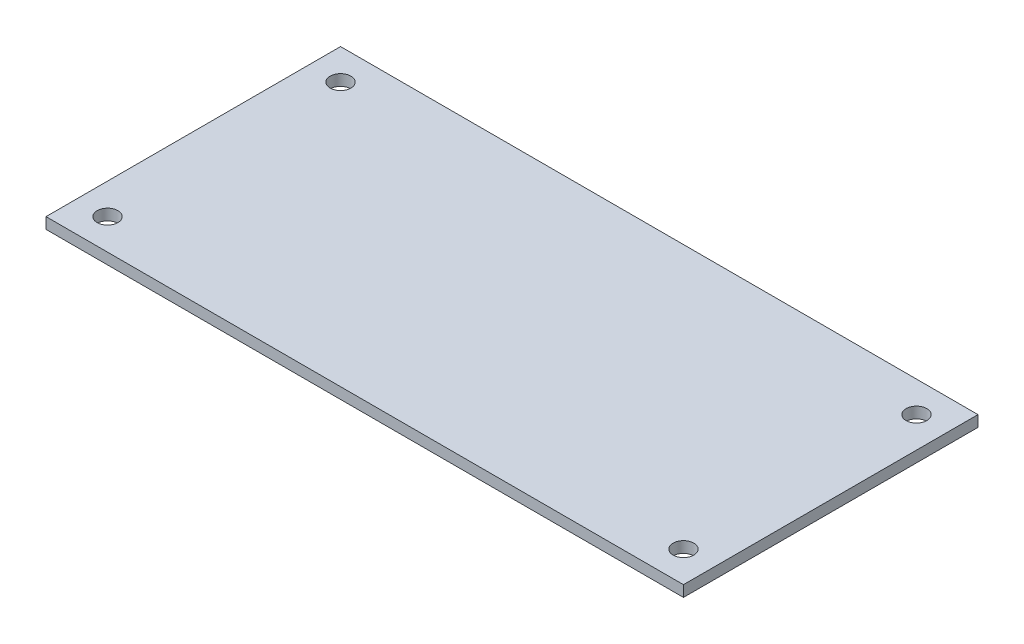
ISO-10303-21;
HEADER;
FILE_DESCRIPTION(('STEP AP214'),'2;1');
FILE_NAME('part.step','',(''),(''),'','','');
FILE_SCHEMA(('AUTOMOTIVE_DESIGN { 1 0 10303 214 1 1 1 1 }'));
ENDSEC;
DATA;
#1=APPLICATION_CONTEXT('core data for automotive mechanical design processes');
#2=APPLICATION_PROTOCOL_DEFINITION('international standard','automotive_design',2000,#1);
#3=PRODUCT_CONTEXT('',#1,'mechanical');
#4=PRODUCT('Part','Part','',(#3));
#5=PRODUCT_RELATED_PRODUCT_CATEGORY('part','',(#4));
#6=PRODUCT_DEFINITION_FORMATION('','',#4);
#7=PRODUCT_DEFINITION_CONTEXT('part definition',#1,'design');
#8=PRODUCT_DEFINITION('design','',#6,#7);
#9=PRODUCT_DEFINITION_SHAPE('','',#8);
#10=(LENGTH_UNIT() NAMED_UNIT(*) SI_UNIT(.MILLI.,.METRE.));
#11=(NAMED_UNIT(*) PLANE_ANGLE_UNIT() SI_UNIT($,.RADIAN.));
#12=(NAMED_UNIT(*) SI_UNIT($,.STERADIAN.) SOLID_ANGLE_UNIT());
#13=UNCERTAINTY_MEASURE_WITH_UNIT(LENGTH_MEASURE(1.E-05),#10,'distance_accuracy_value','');
#14=(GEOMETRIC_REPRESENTATION_CONTEXT(3) GLOBAL_UNCERTAINTY_ASSIGNED_CONTEXT((#13)) GLOBAL_UNIT_ASSIGNED_CONTEXT((#10,
#11,#12)) REPRESENTATION_CONTEXT('',''));
#15=CARTESIAN_POINT('',(0.,0.,0.));
#16=DIRECTION('',(0.,0.,1.));
#17=DIRECTION('',(1.,0.,0.));
#18=AXIS2_PLACEMENT_3D('',#15,#16,#17);
#19=CARTESIAN_POINT('',(46.0375,1.6,-21.2725));
#20=DIRECTION('',(-1.,0.,0.));
#21=DIRECTION('',(0.,0.,1.));
#22=AXIS2_PLACEMENT_3D('',#19,#20,#21);
#23=PLANE('',#22);
#24=DIRECTION('',(0.,0.,-1.));
#25=VECTOR('',#24,1.);
#26=CARTESIAN_POINT('',(46.0375,0.,-21.2725));
#27=LINE('',#26,#25);
#28=CARTESIAN_POINT('',(46.0375,0.,21.2725));
#29=VERTEX_POINT('',#28);
#30=CARTESIAN_POINT('',(46.0375,0.,-21.2725));
#31=VERTEX_POINT('',#30);
#32=EDGE_CURVE('E98',#29,#31,#27,.T.);
#33=ORIENTED_EDGE('',*,*,#32,.T.);
#34=DIRECTION('',(0.,-1.,0.));
#35=VECTOR('',#34,1.);
#36=CARTESIAN_POINT('',(46.0375,1.6,-21.2725));
#37=LINE('',#36,#35);
#38=CARTESIAN_POINT('',(46.0375,1.6,-21.2725));
#39=VERTEX_POINT('',#38);
#40=EDGE_CURVE('E11',#39,#31,#37,.T.);
#41=ORIENTED_EDGE('',*,*,#40,.F.);
#42=DIRECTION('',(0.,0.,-1.));
#43=VECTOR('',#42,1.);
#44=CARTESIAN_POINT('',(46.0375,1.6,-21.2725));
#45=LINE('',#44,#43);
#46=CARTESIAN_POINT('',(46.0375,1.6,21.2725));
#47=VERTEX_POINT('',#46);
#48=EDGE_CURVE('E86',#47,#39,#45,.T.);
#49=ORIENTED_EDGE('',*,*,#48,.F.);
#50=DIRECTION('',(0.,-1.,0.));
#51=VECTOR('',#50,1.);
#52=CARTESIAN_POINT('',(46.0375,1.6,21.2725));
#53=LINE('',#52,#51);
#54=EDGE_CURVE('E94',#47,#29,#53,.T.);
#55=ORIENTED_EDGE('',*,*,#54,.T.);
#56=EDGE_LOOP('',(#33,#41,#49,#55));
#57=FACE_BOUND('',#56,.T.);
#58=ADVANCED_FACE('F35',(#57),#23,.F.);
#59=CARTESIAN_POINT('',(-46.0375,1.6,-21.2725));
#60=DIRECTION('',(0.,0.,1.));
#61=DIRECTION('',(1.,0.,0.));
#62=AXIS2_PLACEMENT_3D('',#59,#60,#61);
#63=PLANE('',#62);
#64=DIRECTION('',(-1.,0.,0.));
#65=VECTOR('',#64,1.);
#66=CARTESIAN_POINT('',(-46.0375,0.,-21.2725));
#67=LINE('',#66,#65);
#68=CARTESIAN_POINT('',(-46.0375,0.,-21.2725));
#69=VERTEX_POINT('',#68);
#70=EDGE_CURVE('E90',#31,#69,#67,.T.);
#71=ORIENTED_EDGE('',*,*,#70,.T.);
#72=DIRECTION('',(0.,-1.,0.));
#73=VECTOR('',#72,1.);
#74=CARTESIAN_POINT('',(-46.0375,1.6,-21.2725));
#75=LINE('',#74,#73);
#76=CARTESIAN_POINT('',(-46.0375,1.6,-21.2725));
#77=VERTEX_POINT('',#76);
#78=EDGE_CURVE('E43',#77,#69,#75,.T.);
#79=ORIENTED_EDGE('',*,*,#78,.F.);
#80=DIRECTION('',(-1.,0.,0.));
#81=VECTOR('',#80,1.);
#82=CARTESIAN_POINT('',(-46.0375,1.6,-21.2725));
#83=LINE('',#82,#81);
#84=EDGE_CURVE('E81',#39,#77,#83,.T.);
#85=ORIENTED_EDGE('',*,*,#84,.F.);
#86=ORIENTED_EDGE('',*,*,#40,.T.);
#87=EDGE_LOOP('',(#71,#79,#85,#86));
#88=FACE_BOUND('',#87,.T.);
#89=ADVANCED_FACE('F89',(#88),#63,.F.);
#90=CARTESIAN_POINT('',(-46.0375,1.6,-21.2725));
#91=DIRECTION('',(1.,0.,0.));
#92=DIRECTION('',(0.,0.,-1.));
#93=AXIS2_PLACEMENT_3D('',#90,#91,#92);
#94=PLANE('',#93);
#95=DIRECTION('',(0.,0.,1.));
#96=VECTOR('',#95,1.);
#97=CARTESIAN_POINT('',(-46.0375,0.,-21.2725));
#98=LINE('',#97,#96);
#99=CARTESIAN_POINT('',(-46.0375,0.,21.2725));
#100=VERTEX_POINT('',#99);
#101=EDGE_CURVE('E68',#69,#100,#98,.T.);
#102=ORIENTED_EDGE('',*,*,#101,.T.);
#103=DIRECTION('',(0.,-1.,0.));
#104=VECTOR('',#103,1.);
#105=CARTESIAN_POINT('',(-46.0375,1.6,21.2725));
#106=LINE('',#105,#104);
#107=CARTESIAN_POINT('',(-46.0375,1.6,21.2725));
#108=VERTEX_POINT('',#107);
#109=EDGE_CURVE('E91',#108,#100,#106,.T.);
#110=ORIENTED_EDGE('',*,*,#109,.F.);
#111=DIRECTION('',(0.,0.,1.));
#112=VECTOR('',#111,1.);
#113=CARTESIAN_POINT('',(-46.0375,1.6,-21.2725));
#114=LINE('',#113,#112);
#115=EDGE_CURVE('E84',#77,#108,#114,.T.);
#116=ORIENTED_EDGE('',*,*,#115,.F.);
#117=ORIENTED_EDGE('',*,*,#78,.T.);
#118=EDGE_LOOP('',(#102,#110,#116,#117));
#119=FACE_BOUND('',#118,.T.);
#120=ADVANCED_FACE('F92',(#119),#94,.F.);
#121=CARTESIAN_POINT('',(-46.0375,1.6,21.2725));
#122=DIRECTION('',(0.,0.,-1.));
#123=DIRECTION('',(-1.,0.,0.));
#124=AXIS2_PLACEMENT_3D('',#121,#122,#123);
#125=PLANE('',#124);
#126=DIRECTION('',(1.,0.,0.));
#127=VECTOR('',#126,1.);
#128=CARTESIAN_POINT('',(-46.0375,0.,21.2725));
#129=LINE('',#128,#127);
#130=EDGE_CURVE('E74',#100,#29,#129,.T.);
#131=ORIENTED_EDGE('',*,*,#130,.T.);
#132=ORIENTED_EDGE('',*,*,#54,.F.);
#133=DIRECTION('',(1.,0.,0.));
#134=VECTOR('',#133,1.);
#135=CARTESIAN_POINT('',(-46.0375,1.6,21.2725));
#136=LINE('',#135,#134);
#137=EDGE_CURVE('E51',#108,#47,#136,.T.);
#138=ORIENTED_EDGE('',*,*,#137,.F.);
#139=ORIENTED_EDGE('',*,*,#109,.T.);
#140=EDGE_LOOP('',(#131,#132,#138,#139));
#141=FACE_BOUND('',#140,.T.);
#142=ADVANCED_FACE('F106',(#141),#125,.F.);
#143=CARTESIAN_POINT('',(0.,1.6,0.));
#144=DIRECTION('',(0.,1.,0.));
#145=DIRECTION('',(0.,0.,1.));
#146=AXIS2_PLACEMENT_3D('',#143,#144,#145);
#147=PLANE('',#146);
#148=CARTESIAN_POINT('',(-41.5925,1.6,-16.8275));
#149=DIRECTION('',(0.,-1.,0.));
#150=DIRECTION('',(0.,0.,-1.));
#151=AXIS2_PLACEMENT_3D('',#148,#149,#150);
#152=CIRCLE('',#151,1.5);
#153=CARTESIAN_POINT('',(-41.5925,1.6,-18.3275));
#154=VERTEX_POINT('',#153);
#155=EDGE_CURVE('E129',#154,#154,#152,.T.);
#156=ORIENTED_EDGE('',*,*,#155,.T.);
#157=EDGE_LOOP('',(#156));
#158=FACE_BOUND('',#157,.T.);
#159=CARTESIAN_POINT('',(-41.5925,1.6,16.8275));
#160=DIRECTION('',(0.,-1.,0.));
#161=DIRECTION('',(0.,0.,-1.));
#162=AXIS2_PLACEMENT_3D('',#159,#160,#161);
#163=CIRCLE('',#162,1.5);
#164=CARTESIAN_POINT('',(-41.5925,1.6,15.3275));
#165=VERTEX_POINT('',#164);
#166=EDGE_CURVE('E123',#165,#165,#163,.T.);
#167=ORIENTED_EDGE('',*,*,#166,.T.);
#168=EDGE_LOOP('',(#167));
#169=FACE_BOUND('',#168,.T.);
#170=CARTESIAN_POINT('',(41.5925,1.6,16.8275));
#171=DIRECTION('',(0.,-1.,0.));
#172=DIRECTION('',(0.,0.,-1.));
#173=AXIS2_PLACEMENT_3D('',#170,#171,#172);
#174=CIRCLE('',#173,1.5);
#175=CARTESIAN_POINT('',(41.5925,1.6,15.3275));
#176=VERTEX_POINT('',#175);
#177=EDGE_CURVE('E117',#176,#176,#174,.T.);
#178=ORIENTED_EDGE('',*,*,#177,.T.);
#179=EDGE_LOOP('',(#178));
#180=FACE_BOUND('',#179,.T.);
#181=CARTESIAN_POINT('',(41.5925,1.6,-16.8275));
#182=DIRECTION('',(0.,-1.,0.));
#183=DIRECTION('',(0.,0.,-1.));
#184=AXIS2_PLACEMENT_3D('',#181,#182,#183);
#185=CIRCLE('',#184,1.5);
#186=CARTESIAN_POINT('',(41.5925,1.6,-18.3275));
#187=VERTEX_POINT('',#186);
#188=EDGE_CURVE('E101',#187,#187,#185,.T.);
#189=ORIENTED_EDGE('',*,*,#188,.T.);
#190=EDGE_LOOP('',(#189));
#191=FACE_BOUND('',#190,.T.);
#192=ORIENTED_EDGE('',*,*,#48,.T.);
#193=ORIENTED_EDGE('',*,*,#84,.T.);
#194=ORIENTED_EDGE('',*,*,#115,.T.);
#195=ORIENTED_EDGE('',*,*,#137,.T.);
#196=EDGE_LOOP('',(#192,#193,#194,#195));
#197=FACE_BOUND('',#196,.T.);
#198=ADVANCED_FACE('F82',(#158,#169,#180,#191,#197),#147,.T.);
#199=CARTESIAN_POINT('',(0.,0.,0.));
#200=DIRECTION('',(0.,1.,0.));
#201=DIRECTION('',(0.,0.,1.));
#202=AXIS2_PLACEMENT_3D('',#199,#200,#201);
#203=PLANE('',#202);
#204=CARTESIAN_POINT('',(-41.5925,0.,-16.8275));
#205=DIRECTION('',(0.,-1.,0.));
#206=DIRECTION('',(0.,0.,-1.));
#207=AXIS2_PLACEMENT_3D('',#204,#205,#206);
#208=CIRCLE('',#207,1.49999999999999);
#209=CARTESIAN_POINT('',(-41.5925,0.,-18.3275));
#210=VERTEX_POINT('',#209);
#211=EDGE_CURVE('E132',#210,#210,#208,.T.);
#212=ORIENTED_EDGE('',*,*,#211,.F.);
#213=EDGE_LOOP('',(#212));
#214=FACE_BOUND('',#213,.T.);
#215=CARTESIAN_POINT('',(-41.5925,0.,16.8275));
#216=DIRECTION('',(0.,-1.,0.));
#217=DIRECTION('',(0.,0.,-1.));
#218=AXIS2_PLACEMENT_3D('',#215,#216,#217);
#219=CIRCLE('',#218,1.49999999999999);
#220=CARTESIAN_POINT('',(-41.5925,0.,15.3275));
#221=VERTEX_POINT('',#220);
#222=EDGE_CURVE('E126',#221,#221,#219,.T.);
#223=ORIENTED_EDGE('',*,*,#222,.F.);
#224=EDGE_LOOP('',(#223));
#225=FACE_BOUND('',#224,.T.);
#226=CARTESIAN_POINT('',(41.5925,0.,16.8275));
#227=DIRECTION('',(0.,-1.,0.));
#228=DIRECTION('',(0.,0.,-1.));
#229=AXIS2_PLACEMENT_3D('',#226,#227,#228);
#230=CIRCLE('',#229,1.49999999999999);
#231=CARTESIAN_POINT('',(41.5925,0.,15.3275));
#232=VERTEX_POINT('',#231);
#233=EDGE_CURVE('E120',#232,#232,#230,.T.);
#234=ORIENTED_EDGE('',*,*,#233,.F.);
#235=EDGE_LOOP('',(#234));
#236=FACE_BOUND('',#235,.T.);
#237=CARTESIAN_POINT('',(41.5925,0.,-16.8275));
#238=DIRECTION('',(0.,-1.,0.));
#239=DIRECTION('',(0.,0.,-1.));
#240=AXIS2_PLACEMENT_3D('',#237,#238,#239);
#241=CIRCLE('',#240,1.49999999999999);
#242=CARTESIAN_POINT('',(41.5925,0.,-18.3275));
#243=VERTEX_POINT('',#242);
#244=EDGE_CURVE('E114',#243,#243,#241,.T.);
#245=ORIENTED_EDGE('',*,*,#244,.F.);
#246=EDGE_LOOP('',(#245));
#247=FACE_BOUND('',#246,.T.);
#248=ORIENTED_EDGE('',*,*,#32,.F.);
#249=ORIENTED_EDGE('',*,*,#130,.F.);
#250=ORIENTED_EDGE('',*,*,#101,.F.);
#251=ORIENTED_EDGE('',*,*,#70,.F.);
#252=EDGE_LOOP('',(#248,#249,#250,#251));
#253=FACE_BOUND('',#252,.T.);
#254=ADVANCED_FACE('F109',(#214,#225,#236,#247,#253),#203,.F.);
#255=CARTESIAN_POINT('',(41.5925,0.,-16.8275));
#256=DIRECTION('',(0.,-1.,0.));
#257=DIRECTION('',(0.,0.,-1.));
#258=AXIS2_PLACEMENT_3D('',#255,#256,#257);
#259=CYLINDRICAL_SURFACE('',#258,1.49999999999999);
#260=ORIENTED_EDGE('',*,*,#188,.F.);
#261=EDGE_LOOP('',(#260));
#262=FACE_BOUND('',#261,.T.);
#263=ORIENTED_EDGE('',*,*,#244,.T.);
#264=EDGE_LOOP('',(#263));
#265=FACE_BOUND('',#264,.T.);
#266=ADVANCED_FACE('F140',(#262,#265),#259,.F.);
#267=CARTESIAN_POINT('',(41.5925,0.,16.8275));
#268=DIRECTION('',(0.,-1.,0.));
#269=DIRECTION('',(0.,0.,-1.));
#270=AXIS2_PLACEMENT_3D('',#267,#268,#269);
#271=CYLINDRICAL_SURFACE('',#270,1.49999999999999);
#272=ORIENTED_EDGE('',*,*,#177,.F.);
#273=EDGE_LOOP('',(#272));
#274=FACE_BOUND('',#273,.T.);
#275=ORIENTED_EDGE('',*,*,#233,.T.);
#276=EDGE_LOOP('',(#275));
#277=FACE_BOUND('',#276,.T.);
#278=ADVANCED_FACE('F149',(#274,#277),#271,.F.);
#279=CARTESIAN_POINT('',(-41.5925,0.,16.8275));
#280=DIRECTION('',(0.,-1.,0.));
#281=DIRECTION('',(0.,0.,-1.));
#282=AXIS2_PLACEMENT_3D('',#279,#280,#281);
#283=CYLINDRICAL_SURFACE('',#282,1.49999999999999);
#284=ORIENTED_EDGE('',*,*,#166,.F.);
#285=EDGE_LOOP('',(#284));
#286=FACE_BOUND('',#285,.T.);
#287=ORIENTED_EDGE('',*,*,#222,.T.);
#288=EDGE_LOOP('',(#287));
#289=FACE_BOUND('',#288,.T.);
#290=ADVANCED_FACE('F155',(#286,#289),#283,.F.);
#291=CARTESIAN_POINT('',(-41.5925,0.,-16.8275));
#292=DIRECTION('',(0.,-1.,0.));
#293=DIRECTION('',(0.,0.,-1.));
#294=AXIS2_PLACEMENT_3D('',#291,#292,#293);
#295=CYLINDRICAL_SURFACE('',#294,1.49999999999999);
#296=ORIENTED_EDGE('',*,*,#155,.F.);
#297=EDGE_LOOP('',(#296));
#298=FACE_BOUND('',#297,.T.);
#299=ORIENTED_EDGE('',*,*,#211,.T.);
#300=EDGE_LOOP('',(#299));
#301=FACE_BOUND('',#300,.T.);
#302=ADVANCED_FACE('F136',(#298,#301),#295,.F.);
#303=CLOSED_SHELL('',(#58,#89,#120,#142,#198,#254,#266,#278,#290,#302));
#304=MANIFOLD_SOLID_BREP('B2',#303);
#305=ADVANCED_BREP_SHAPE_REPRESENTATION('',(#18,#304),#14);
#306=SHAPE_DEFINITION_REPRESENTATION(#9,#305);
ENDSEC;
END-ISO-10303-21;
